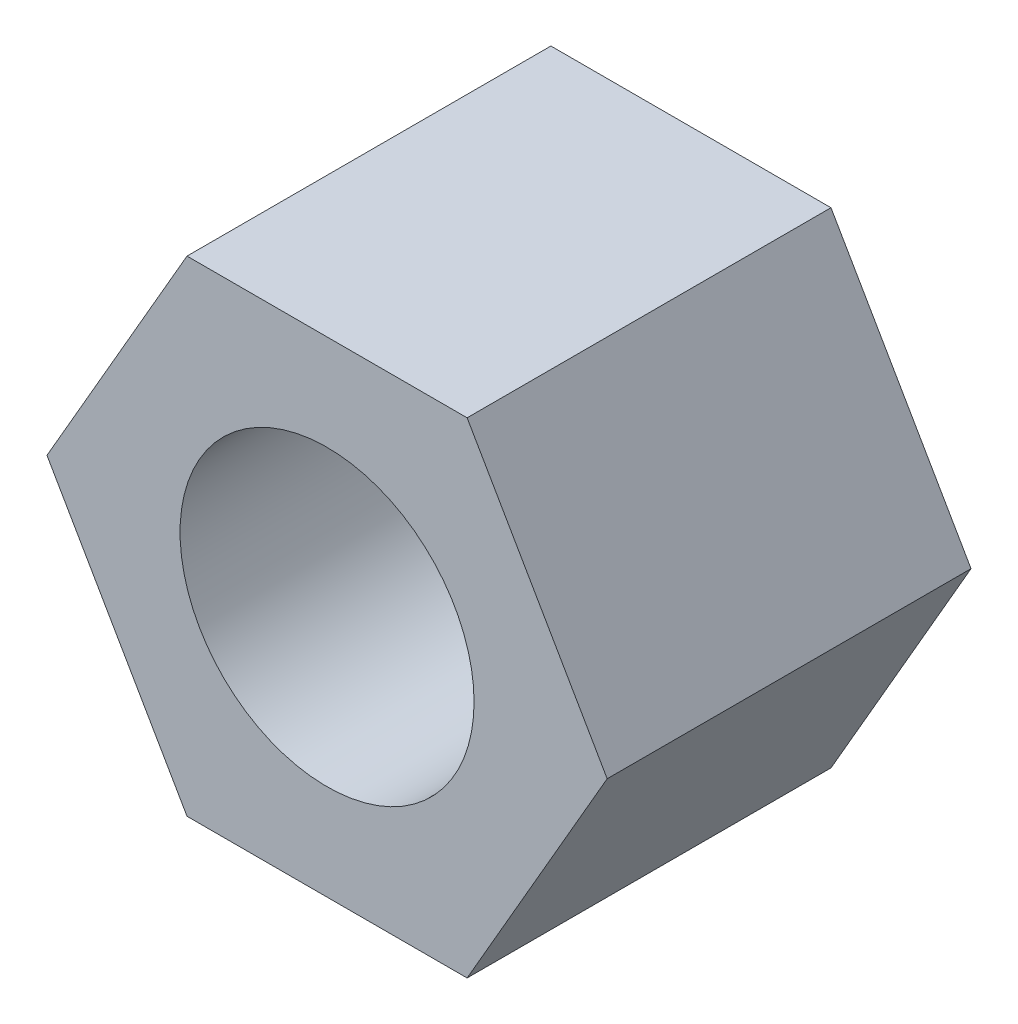
ISO-10303-21;
HEADER;
FILE_DESCRIPTION(('STEP AP214'),'2;1');
FILE_NAME('part.step','',(''),(''),'','','');
FILE_SCHEMA(('AUTOMOTIVE_DESIGN { 1 0 10303 214 1 1 1 1 }'));
ENDSEC;
DATA;
#1=APPLICATION_CONTEXT('core data for automotive mechanical design processes');
#2=APPLICATION_PROTOCOL_DEFINITION('international standard','automotive_design',2000,#1);
#3=PRODUCT_CONTEXT('',#1,'mechanical');
#4=PRODUCT('Part','Part','',(#3));
#5=PRODUCT_RELATED_PRODUCT_CATEGORY('part','',(#4));
#6=PRODUCT_DEFINITION_FORMATION('','',#4);
#7=PRODUCT_DEFINITION_CONTEXT('part definition',#1,'design');
#8=PRODUCT_DEFINITION('design','',#6,#7);
#9=PRODUCT_DEFINITION_SHAPE('','',#8);
#10=(LENGTH_UNIT() NAMED_UNIT(*) SI_UNIT(.MILLI.,.METRE.));
#11=(NAMED_UNIT(*) PLANE_ANGLE_UNIT() SI_UNIT($,.RADIAN.));
#12=(NAMED_UNIT(*) SI_UNIT($,.STERADIAN.) SOLID_ANGLE_UNIT());
#13=UNCERTAINTY_MEASURE_WITH_UNIT(LENGTH_MEASURE(1.E-05),#10,'distance_accuracy_value','');
#14=(GEOMETRIC_REPRESENTATION_CONTEXT(3) GLOBAL_UNCERTAINTY_ASSIGNED_CONTEXT((#13)) GLOBAL_UNIT_ASSIGNED_CONTEXT((#10,
#11,#12)) REPRESENTATION_CONTEXT('',''));
#15=CARTESIAN_POINT('',(0.,0.,0.));
#16=DIRECTION('',(0.,0.,1.));
#17=DIRECTION('',(1.,0.,0.));
#18=AXIS2_PLACEMENT_3D('',#15,#16,#17);
#19=CARTESIAN_POINT('',(0.,0.,7.5));
#20=DIRECTION('',(0.,0.,1.));
#21=DIRECTION('',(1.,0.,0.));
#22=AXIS2_PLACEMENT_3D('',#19,#20,#21);
#23=PLANE('',#22);
#24=DIRECTION('',(0.5,0.866025403784439,0.));
#25=VECTOR('',#24,1.);
#26=CARTESIAN_POINT('',(2.88675134594813,-5.,7.5));
#27=LINE('',#26,#25);
#28=CARTESIAN_POINT('',(2.88675134594813,-5.,7.5));
#29=VERTEX_POINT('',#28);
#30=CARTESIAN_POINT('',(5.77350269189626,0.,7.5));
#31=VERTEX_POINT('',#30);
#32=EDGE_CURVE('E133',#29,#31,#27,.T.);
#33=ORIENTED_EDGE('',*,*,#32,.T.);
#34=DIRECTION('',(-0.5,0.866025403784439,0.));
#35=VECTOR('',#34,1.);
#36=CARTESIAN_POINT('',(5.77350269189626,0.,7.5));
#37=LINE('',#36,#35);
#38=CARTESIAN_POINT('',(2.88675134594813,5.,7.5));
#39=VERTEX_POINT('',#38);
#40=EDGE_CURVE('E91',#31,#39,#37,.T.);
#41=ORIENTED_EDGE('',*,*,#40,.T.);
#42=DIRECTION('',(-1.,0.,0.));
#43=VECTOR('',#42,1.);
#44=CARTESIAN_POINT('',(2.88675134594813,5.,7.5));
#45=LINE('',#44,#43);
#46=CARTESIAN_POINT('',(-2.88675134594813,5.,7.5));
#47=VERTEX_POINT('',#46);
#48=EDGE_CURVE('E106',#39,#47,#45,.T.);
#49=ORIENTED_EDGE('',*,*,#48,.T.);
#50=DIRECTION('',(-0.5,-0.866025403784439,0.));
#51=VECTOR('',#50,1.);
#52=CARTESIAN_POINT('',(-2.88675134594813,5.,7.5));
#53=LINE('',#52,#51);
#54=CARTESIAN_POINT('',(-5.77350269189626,0.,7.5));
#55=VERTEX_POINT('',#54);
#56=EDGE_CURVE('E99',#47,#55,#53,.T.);
#57=ORIENTED_EDGE('',*,*,#56,.T.);
#58=DIRECTION('',(0.5,-0.866025403784439,0.));
#59=VECTOR('',#58,1.);
#60=CARTESIAN_POINT('',(-5.77350269189626,0.,7.5));
#61=LINE('',#60,#59);
#62=CARTESIAN_POINT('',(-2.88675134594813,-5.,7.5));
#63=VERTEX_POINT('',#62);
#64=EDGE_CURVE('E102',#55,#63,#61,.T.);
#65=ORIENTED_EDGE('',*,*,#64,.T.);
#66=DIRECTION('',(1.,0.,0.));
#67=VECTOR('',#66,1.);
#68=CARTESIAN_POINT('',(-2.88675134594813,-5.,7.5));
#69=LINE('',#68,#67);
#70=EDGE_CURVE('E57',#63,#29,#69,.T.);
#71=ORIENTED_EDGE('',*,*,#70,.T.);
#72=EDGE_LOOP('',(#33,#41,#49,#57,#65,#71));
#73=FACE_BOUND('',#72,.T.);
#74=CARTESIAN_POINT('',(0.,0.,7.5));
#75=DIRECTION('',(0.,0.,1.));
#76=DIRECTION('',(1.,0.,0.));
#77=AXIS2_PLACEMENT_3D('',#74,#75,#76);
#78=CIRCLE('',#77,3.03);
#79=CARTESIAN_POINT('',(3.03,0.,7.5));
#80=VERTEX_POINT('',#79);
#81=EDGE_CURVE('E126',#80,#80,#78,.T.);
#82=ORIENTED_EDGE('',*,*,#81,.F.);
#83=EDGE_LOOP('',(#82));
#84=FACE_BOUND('',#83,.T.);
#85=ADVANCED_FACE('F39',(#73,#84),#23,.T.);
#86=CARTESIAN_POINT('',(0.,0.,0.));
#87=DIRECTION('',(0.,0.,1.));
#88=DIRECTION('',(1.,0.,0.));
#89=AXIS2_PLACEMENT_3D('',#86,#87,#88);
#90=PLANE('',#89);
#91=DIRECTION('',(0.5,0.866025403784439,0.));
#92=VECTOR('',#91,1.);
#93=CARTESIAN_POINT('',(2.88675134594813,-5.,0.));
#94=LINE('',#93,#92);
#95=CARTESIAN_POINT('',(2.88675134594813,-5.,0.));
#96=VERTEX_POINT('',#95);
#97=CARTESIAN_POINT('',(5.77350269189626,0.,0.));
#98=VERTEX_POINT('',#97);
#99=EDGE_CURVE('E123',#96,#98,#94,.T.);
#100=ORIENTED_EDGE('',*,*,#99,.F.);
#101=DIRECTION('',(1.,0.,0.));
#102=VECTOR('',#101,1.);
#103=CARTESIAN_POINT('',(-2.88675134594813,-5.,0.));
#104=LINE('',#103,#102);
#105=CARTESIAN_POINT('',(-2.88675134594813,-5.,0.));
#106=VERTEX_POINT('',#105);
#107=EDGE_CURVE('E84',#106,#96,#104,.T.);
#108=ORIENTED_EDGE('',*,*,#107,.F.);
#109=DIRECTION('',(0.5,-0.866025403784439,0.));
#110=VECTOR('',#109,1.);
#111=CARTESIAN_POINT('',(-5.77350269189626,0.,0.));
#112=LINE('',#111,#110);
#113=CARTESIAN_POINT('',(-5.77350269189626,0.,0.));
#114=VERTEX_POINT('',#113);
#115=EDGE_CURVE('E76',#114,#106,#112,.T.);
#116=ORIENTED_EDGE('',*,*,#115,.F.);
#117=DIRECTION('',(-0.5,-0.866025403784439,0.));
#118=VECTOR('',#117,1.);
#119=CARTESIAN_POINT('',(-2.88675134594813,5.,0.));
#120=LINE('',#119,#118);
#121=CARTESIAN_POINT('',(-2.88675134594813,5.,0.));
#122=VERTEX_POINT('',#121);
#123=EDGE_CURVE('E111',#122,#114,#120,.T.);
#124=ORIENTED_EDGE('',*,*,#123,.F.);
#125=DIRECTION('',(-1.,0.,0.));
#126=VECTOR('',#125,1.);
#127=CARTESIAN_POINT('',(2.88675134594813,5.,0.));
#128=LINE('',#127,#126);
#129=CARTESIAN_POINT('',(2.88675134594813,5.,0.));
#130=VERTEX_POINT('',#129);
#131=EDGE_CURVE('E128',#130,#122,#128,.T.);
#132=ORIENTED_EDGE('',*,*,#131,.F.);
#133=DIRECTION('',(-0.5,0.866025403784439,0.));
#134=VECTOR('',#133,1.);
#135=CARTESIAN_POINT('',(5.77350269189626,0.,0.));
#136=LINE('',#135,#134);
#137=EDGE_CURVE('E130',#98,#130,#136,.T.);
#138=ORIENTED_EDGE('',*,*,#137,.F.);
#139=EDGE_LOOP('',(#100,#108,#116,#124,#132,#138));
#140=FACE_BOUND('',#139,.T.);
#141=CARTESIAN_POINT('',(0.,0.,0.));
#142=DIRECTION('',(0.,0.,1.));
#143=DIRECTION('',(1.,0.,0.));
#144=AXIS2_PLACEMENT_3D('',#141,#142,#143);
#145=CIRCLE('',#144,3.03);
#146=CARTESIAN_POINT('',(3.03,0.,0.));
#147=VERTEX_POINT('',#146);
#148=EDGE_CURVE('E229',#147,#147,#145,.T.);
#149=ORIENTED_EDGE('',*,*,#148,.T.);
#150=EDGE_LOOP('',(#149));
#151=FACE_BOUND('',#150,.T.);
#152=ADVANCED_FACE('F145',(#140,#151),#90,.F.);
#153=CARTESIAN_POINT('',(2.88675134594813,-5.,7.5));
#154=DIRECTION('',(-0.866025403784439,0.5,0.));
#155=DIRECTION('',(-0.5,-0.866025403784439,0.));
#156=AXIS2_PLACEMENT_3D('',#153,#154,#155);
#157=PLANE('',#156);
#158=ORIENTED_EDGE('',*,*,#99,.T.);
#159=DIRECTION('',(0.,0.,-1.));
#160=VECTOR('',#159,1.);
#161=CARTESIAN_POINT('',(5.77350269189626,0.,7.5));
#162=LINE('',#161,#160);
#163=EDGE_CURVE('E11',#31,#98,#162,.T.);
#164=ORIENTED_EDGE('',*,*,#163,.F.);
#165=ORIENTED_EDGE('',*,*,#32,.F.);
#166=DIRECTION('',(0.,0.,-1.));
#167=VECTOR('',#166,1.);
#168=CARTESIAN_POINT('',(2.88675134594813,-5.,7.5));
#169=LINE('',#168,#167);
#170=EDGE_CURVE('E118',#29,#96,#169,.T.);
#171=ORIENTED_EDGE('',*,*,#170,.T.);
#172=EDGE_LOOP('',(#158,#164,#165,#171));
#173=FACE_BOUND('',#172,.T.);
#174=ADVANCED_FACE('F41',(#173),#157,.F.);
#175=CARTESIAN_POINT('',(5.77350269189626,0.,7.5));
#176=DIRECTION('',(-0.866025403784439,-0.5,0.));
#177=DIRECTION('',(0.5,-0.866025403784439,0.));
#178=AXIS2_PLACEMENT_3D('',#175,#176,#177);
#179=PLANE('',#178);
#180=ORIENTED_EDGE('',*,*,#137,.T.);
#181=DIRECTION('',(0.,0.,-1.));
#182=VECTOR('',#181,1.);
#183=CARTESIAN_POINT('',(2.88675134594813,5.,7.5));
#184=LINE('',#183,#182);
#185=EDGE_CURVE('E48',#39,#130,#184,.T.);
#186=ORIENTED_EDGE('',*,*,#185,.F.);
#187=ORIENTED_EDGE('',*,*,#40,.F.);
#188=ORIENTED_EDGE('',*,*,#163,.T.);
#189=EDGE_LOOP('',(#180,#186,#187,#188));
#190=FACE_BOUND('',#189,.T.);
#191=ADVANCED_FACE('F166',(#190),#179,.F.);
#192=CARTESIAN_POINT('',(2.88675134594813,5.,7.5));
#193=DIRECTION('',(0.,-1.,0.));
#194=DIRECTION('',(1.,0.,0.));
#195=AXIS2_PLACEMENT_3D('',#192,#193,#194);
#196=PLANE('',#195);
#197=ORIENTED_EDGE('',*,*,#131,.T.);
#198=DIRECTION('',(0.,0.,-1.));
#199=VECTOR('',#198,1.);
#200=CARTESIAN_POINT('',(-2.88675134594813,5.,7.5));
#201=LINE('',#200,#199);
#202=EDGE_CURVE('E113',#47,#122,#201,.T.);
#203=ORIENTED_EDGE('',*,*,#202,.F.);
#204=ORIENTED_EDGE('',*,*,#48,.F.);
#205=ORIENTED_EDGE('',*,*,#185,.T.);
#206=EDGE_LOOP('',(#197,#203,#204,#205));
#207=FACE_BOUND('',#206,.T.);
#208=ADVANCED_FACE('F143',(#207),#196,.F.);
#209=CARTESIAN_POINT('',(-2.88675134594813,5.,7.5));
#210=DIRECTION('',(0.866025403784439,-0.5,0.));
#211=DIRECTION('',(0.5,0.866025403784439,0.));
#212=AXIS2_PLACEMENT_3D('',#209,#210,#211);
#213=PLANE('',#212);
#214=ORIENTED_EDGE('',*,*,#123,.T.);
#215=DIRECTION('',(0.,0.,-1.));
#216=VECTOR('',#215,1.);
#217=CARTESIAN_POINT('',(-5.77350269189626,0.,7.5));
#218=LINE('',#217,#216);
#219=EDGE_CURVE('E112',#55,#114,#218,.T.);
#220=ORIENTED_EDGE('',*,*,#219,.F.);
#221=ORIENTED_EDGE('',*,*,#56,.F.);
#222=ORIENTED_EDGE('',*,*,#202,.T.);
#223=EDGE_LOOP('',(#214,#220,#221,#222));
#224=FACE_BOUND('',#223,.T.);
#225=ADVANCED_FACE('F115',(#224),#213,.F.);
#226=CARTESIAN_POINT('',(-5.77350269189626,0.,7.5));
#227=DIRECTION('',(0.866025403784439,0.5,0.));
#228=DIRECTION('',(-0.5,0.866025403784439,0.));
#229=AXIS2_PLACEMENT_3D('',#226,#227,#228);
#230=PLANE('',#229);
#231=ORIENTED_EDGE('',*,*,#115,.T.);
#232=DIRECTION('',(0.,0.,-1.));
#233=VECTOR('',#232,1.);
#234=CARTESIAN_POINT('',(-2.88675134594813,-5.,7.5));
#235=LINE('',#234,#233);
#236=EDGE_CURVE('E117',#63,#106,#235,.T.);
#237=ORIENTED_EDGE('',*,*,#236,.F.);
#238=ORIENTED_EDGE('',*,*,#64,.F.);
#239=ORIENTED_EDGE('',*,*,#219,.T.);
#240=EDGE_LOOP('',(#231,#237,#238,#239));
#241=FACE_BOUND('',#240,.T.);
#242=ADVANCED_FACE('F119',(#241),#230,.F.);
#243=CARTESIAN_POINT('',(-2.88675134594813,-5.,7.5));
#244=DIRECTION('',(0.,1.,0.));
#245=DIRECTION('',(-1.,0.,0.));
#246=AXIS2_PLACEMENT_3D('',#243,#244,#245);
#247=PLANE('',#246);
#248=ORIENTED_EDGE('',*,*,#107,.T.);
#249=ORIENTED_EDGE('',*,*,#170,.F.);
#250=ORIENTED_EDGE('',*,*,#70,.F.);
#251=ORIENTED_EDGE('',*,*,#236,.T.);
#252=EDGE_LOOP('',(#248,#249,#250,#251));
#253=FACE_BOUND('',#252,.T.);
#254=ADVANCED_FACE('F149',(#253),#247,.F.);
#255=CARTESIAN_POINT('',(0.,0.,7.5));
#256=DIRECTION('',(0.,0.,-1.));
#257=DIRECTION('',(-1.,0.,0.));
#258=AXIS2_PLACEMENT_3D('',#255,#256,#257);
#259=CYLINDRICAL_SURFACE('',#258,3.03);
#260=ORIENTED_EDGE('',*,*,#81,.T.);
#261=EDGE_LOOP('',(#260));
#262=FACE_BOUND('',#261,.T.);
#263=ORIENTED_EDGE('',*,*,#148,.F.);
#264=EDGE_LOOP('',(#263));
#265=FACE_BOUND('',#264,.T.);
#266=ADVANCED_FACE('F151',(#262,#265),#259,.F.);
#267=CLOSED_SHELL('',(#85,#152,#174,#191,#208,#225,#242,#254,#266));
#268=MANIFOLD_SOLID_BREP('B2',#267);
#269=ADVANCED_BREP_SHAPE_REPRESENTATION('',(#18,#268),#14);
#270=SHAPE_DEFINITION_REPRESENTATION(#9,#269);
ENDSEC;
END-ISO-10303-21;
